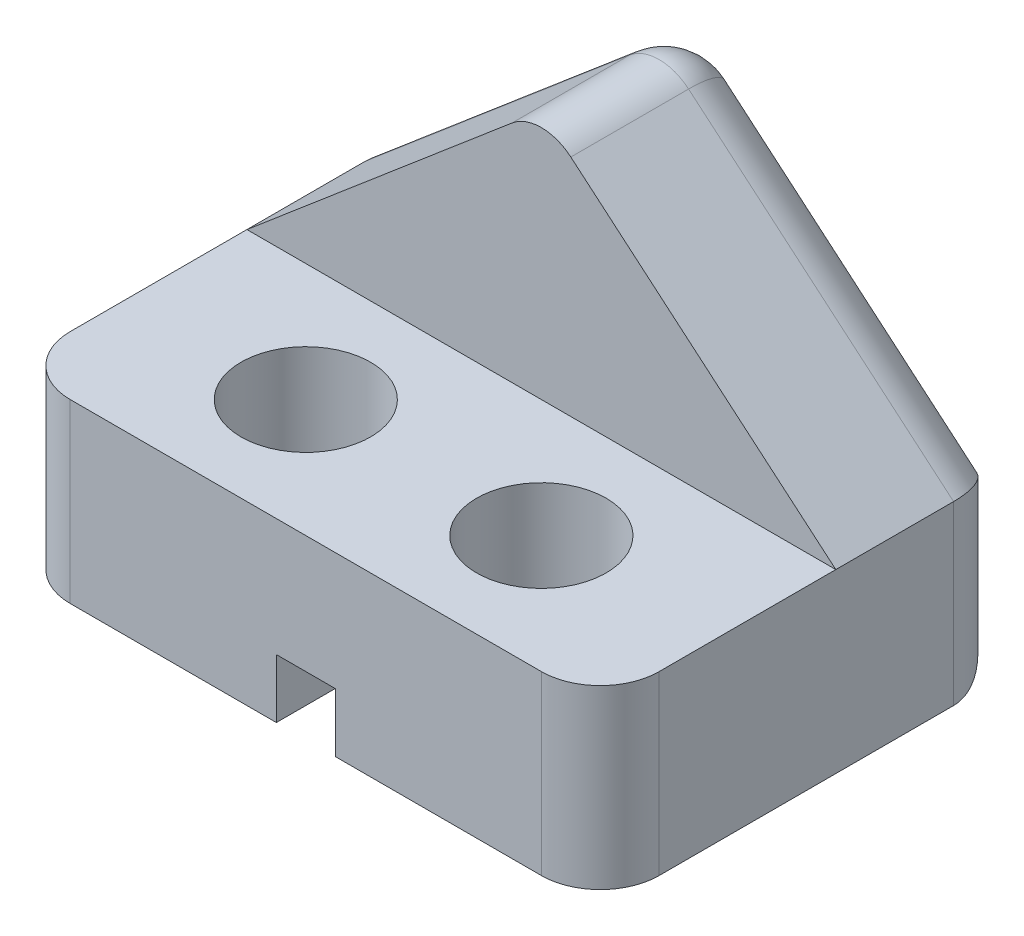
ISO-10303-21;
HEADER;
FILE_DESCRIPTION(('STEP AP214'),'2;1');
FILE_NAME('part.step','',(''),(''),'','','');
FILE_SCHEMA(('AUTOMOTIVE_DESIGN { 1 0 10303 214 1 1 1 1 }'));
ENDSEC;
DATA;
#1=APPLICATION_CONTEXT('core data for automotive mechanical design processes');
#2=APPLICATION_PROTOCOL_DEFINITION('international standard','automotive_design',2000,#1);
#3=PRODUCT_CONTEXT('',#1,'mechanical');
#4=PRODUCT('Part','Part','',(#3));
#5=PRODUCT_RELATED_PRODUCT_CATEGORY('part','',(#4));
#6=PRODUCT_DEFINITION_FORMATION('','',#4);
#7=PRODUCT_DEFINITION_CONTEXT('part definition',#1,'design');
#8=PRODUCT_DEFINITION('design','',#6,#7);
#9=PRODUCT_DEFINITION_SHAPE('','',#8);
#10=(LENGTH_UNIT() NAMED_UNIT(*) SI_UNIT(.MILLI.,.METRE.));
#11=(NAMED_UNIT(*) PLANE_ANGLE_UNIT() SI_UNIT($,.RADIAN.));
#12=(NAMED_UNIT(*) SI_UNIT($,.STERADIAN.) SOLID_ANGLE_UNIT());
#13=UNCERTAINTY_MEASURE_WITH_UNIT(LENGTH_MEASURE(1.E-05),#10,'distance_accuracy_value','');
#14=(GEOMETRIC_REPRESENTATION_CONTEXT(3) GLOBAL_UNCERTAINTY_ASSIGNED_CONTEXT((#13)) GLOBAL_UNIT_ASSIGNED_CONTEXT((#10,
#11,#12)) REPRESENTATION_CONTEXT('',''));
#15=CARTESIAN_POINT('',(0.,0.,0.));
#16=DIRECTION('',(0.,0.,1.));
#17=DIRECTION('',(1.,0.,0.));
#18=AXIS2_PLACEMENT_3D('',#15,#16,#17);
#19=CARTESIAN_POINT('',(0.,0.,0.));
#20=DIRECTION('',(0.,1.,0.));
#21=DIRECTION('',(0.,0.,1.));
#22=AXIS2_PLACEMENT_3D('',#19,#20,#21);
#23=PLANE('',#22);
#24=CARTESIAN_POINT('',(-2.,0.,0.));
#25=DIRECTION('',(0.,1.,0.));
#26=DIRECTION('',(0.,0.,1.));
#27=AXIS2_PLACEMENT_3D('',#24,#25,#26);
#28=CIRCLE('',#27,1.1);
#29=CARTESIAN_POINT('',(-2.,0.,1.1));
#30=VERTEX_POINT('',#29);
#31=EDGE_CURVE('E217',#30,#30,#28,.T.);
#32=ORIENTED_EDGE('',*,*,#31,.T.);
#33=EDGE_LOOP('',(#32));
#34=FACE_BOUND('',#33,.T.);
#35=DIRECTION('',(0.,0.,1.));
#36=VECTOR('',#35,1.);
#37=CARTESIAN_POINT('',(-5.,0.,-2.));
#38=LINE('',#37,#36);
#39=CARTESIAN_POINT('',(-5.,0.,-4.));
#40=VERTEX_POINT('',#39);
#41=CARTESIAN_POINT('',(-5.,0.,1.));
#42=VERTEX_POINT('',#41);
#43=EDGE_CURVE('E238',#40,#42,#38,.T.);
#44=ORIENTED_EDGE('',*,*,#43,.F.);
#45=DIRECTION('',(-1.,0.,0.));
#46=VECTOR('',#45,1.);
#47=CARTESIAN_POINT('',(0.,0.,-4.));
#48=LINE('',#47,#46);
#49=CARTESIAN_POINT('',(-0.5,0.,-4.));
#50=VERTEX_POINT('',#49);
#51=EDGE_CURVE('E285',#40,#50,#48,.F.);
#52=ORIENTED_EDGE('',*,*,#51,.T.);
#53=DIRECTION('',(0.,0.,-1.));
#54=VECTOR('',#53,1.);
#55=CARTESIAN_POINT('',(-0.5,0.,2.));
#56=LINE('',#55,#54);
#57=CARTESIAN_POINT('',(-0.5,0.,2.));
#58=VERTEX_POINT('',#57);
#59=EDGE_CURVE('E189',#58,#50,#56,.T.);
#60=ORIENTED_EDGE('',*,*,#59,.F.);
#61=DIRECTION('',(1.,0.,0.));
#62=VECTOR('',#61,1.);
#63=CARTESIAN_POINT('',(-5.,0.,2.));
#64=LINE('',#63,#62);
#65=CARTESIAN_POINT('',(-4.,0.,2.));
#66=VERTEX_POINT('',#65);
#67=EDGE_CURVE('E183',#66,#58,#64,.T.);
#68=ORIENTED_EDGE('',*,*,#67,.F.);
#69=CARTESIAN_POINT('',(-4.,0.,1.));
#70=DIRECTION('',(0.,1.,0.));
#71=DIRECTION('',(0.,0.,1.));
#72=AXIS2_PLACEMENT_3D('',#69,#70,#71);
#73=CIRCLE('',#72,1.);
#74=EDGE_CURVE('E283',#66,#42,#73,.F.);
#75=ORIENTED_EDGE('',*,*,#74,.T.);
#76=EDGE_LOOP('',(#44,#52,#60,#68,#75));
#77=FACE_BOUND('',#76,.T.);
#78=ADVANCED_FACE('F35',(#34,#77),#23,.F.);
#79=CARTESIAN_POINT('',(0.,3.,0.));
#80=DIRECTION('',(0.,1.,0.));
#81=DIRECTION('',(0.,0.,1.));
#82=AXIS2_PLACEMENT_3D('',#79,#80,#81);
#83=PLANE('',#82);
#84=CARTESIAN_POINT('',(-2.,3.,0.));
#85=DIRECTION('',(0.,1.,0.));
#86=DIRECTION('',(0.,0.,1.));
#87=AXIS2_PLACEMENT_3D('',#84,#85,#86);
#88=CIRCLE('',#87,1.1);
#89=CARTESIAN_POINT('',(-2.,3.,1.1));
#90=VERTEX_POINT('',#89);
#91=EDGE_CURVE('E220',#90,#90,#88,.T.);
#92=ORIENTED_EDGE('',*,*,#91,.F.);
#93=EDGE_LOOP('',(#92));
#94=FACE_BOUND('',#93,.T.);
#95=DIRECTION('',(1.,0.,0.));
#96=VECTOR('',#95,1.);
#97=CARTESIAN_POINT('',(-5.,3.,2.));
#98=LINE('',#97,#96);
#99=CARTESIAN_POINT('',(-4.,3.,2.));
#100=VERTEX_POINT('',#99);
#101=CARTESIAN_POINT('',(4.,3.,2.));
#102=VERTEX_POINT('',#101);
#103=EDGE_CURVE('E233',#100,#102,#98,.T.);
#104=ORIENTED_EDGE('',*,*,#103,.T.);
#105=CARTESIAN_POINT('',(4.,3.,1.));
#106=DIRECTION('',(0.,1.,0.));
#107=DIRECTION('',(0.,0.,1.));
#108=AXIS2_PLACEMENT_3D('',#105,#106,#107);
#109=CIRCLE('',#108,1.);
#110=CARTESIAN_POINT('',(5.,3.,1.));
#111=VERTEX_POINT('',#110);
#112=EDGE_CURVE('E11',#102,#111,#109,.T.);
#113=ORIENTED_EDGE('',*,*,#112,.T.);
#114=DIRECTION('',(0.,0.,-1.));
#115=VECTOR('',#114,1.);
#116=CARTESIAN_POINT('',(5.,3.,-2.));
#117=LINE('',#116,#115);
#118=CARTESIAN_POINT('',(5.,3.,-2.));
#119=VERTEX_POINT('',#118);
#120=EDGE_CURVE('E226',#111,#119,#117,.T.);
#121=ORIENTED_EDGE('',*,*,#120,.T.);
#122=DIRECTION('',(-1.,0.,0.));
#123=VECTOR('',#122,1.);
#124=CARTESIAN_POINT('',(-5.,3.,-2.));
#125=LINE('',#124,#123);
#126=CARTESIAN_POINT('',(-5.,3.,-2.));
#127=VERTEX_POINT('',#126);
#128=EDGE_CURVE('E228',#119,#127,#125,.T.);
#129=ORIENTED_EDGE('',*,*,#128,.T.);
#130=DIRECTION('',(0.,0.,1.));
#131=VECTOR('',#130,1.);
#132=CARTESIAN_POINT('',(-5.,3.,-2.));
#133=LINE('',#132,#131);
#134=CARTESIAN_POINT('',(-5.,3.,1.));
#135=VERTEX_POINT('',#134);
#136=EDGE_CURVE('E231',#127,#135,#133,.T.);
#137=ORIENTED_EDGE('',*,*,#136,.T.);
#138=CARTESIAN_POINT('',(-4.,3.,1.));
#139=DIRECTION('',(0.,1.,0.));
#140=DIRECTION('',(0.,0.,1.));
#141=AXIS2_PLACEMENT_3D('',#138,#139,#140);
#142=CIRCLE('',#141,1.);
#143=EDGE_CURVE('E44',#135,#100,#142,.T.);
#144=ORIENTED_EDGE('',*,*,#143,.T.);
#145=EDGE_LOOP('',(#104,#113,#121,#129,#137,#144));
#146=FACE_BOUND('',#145,.T.);
#147=CARTESIAN_POINT('',(2.,3.,0.));
#148=DIRECTION('',(0.,1.,0.));
#149=DIRECTION('',(0.,0.,-1.));
#150=AXIS2_PLACEMENT_3D('',#147,#148,#149);
#151=CIRCLE('',#150,1.1);
#152=CARTESIAN_POINT('',(2.,3.,-1.1));
#153=VERTEX_POINT('',#152);
#154=EDGE_CURVE('E214',#153,#153,#151,.T.);
#155=ORIENTED_EDGE('',*,*,#154,.F.);
#156=EDGE_LOOP('',(#155));
#157=FACE_BOUND('',#156,.T.);
#158=ADVANCED_FACE('F372',(#94,#146,#157),#83,.T.);
#159=DIRECTION('',(0.,0.,-1.));
#160=VECTOR('',#159,1.);
#161=CARTESIAN_POINT('',(0.5,0.,2.));
#162=LINE('',#161,#160);
#163=CARTESIAN_POINT('',(0.5,0.,2.));
#164=VERTEX_POINT('',#163);
#165=CARTESIAN_POINT('',(0.5,0.,-4.));
#166=VERTEX_POINT('',#165);
#167=EDGE_CURVE('E192',#164,#166,#162,.T.);
#168=ORIENTED_EDGE('',*,*,#167,.T.);
#169=DIRECTION('',(-1.,0.,0.));
#170=VECTOR('',#169,1.);
#171=CARTESIAN_POINT('',(0.,0.,-4.));
#172=LINE('',#171,#170);
#173=CARTESIAN_POINT('',(5.,0.,-4.));
#174=VERTEX_POINT('',#173);
#175=EDGE_CURVE('E266',#166,#174,#172,.F.);
#176=ORIENTED_EDGE('',*,*,#175,.T.);
#177=DIRECTION('',(0.,0.,-1.));
#178=VECTOR('',#177,1.);
#179=CARTESIAN_POINT('',(5.,0.,-2.));
#180=LINE('',#179,#178);
#181=CARTESIAN_POINT('',(5.,0.,1.));
#182=VERTEX_POINT('',#181);
#183=EDGE_CURVE('E223',#182,#174,#180,.T.);
#184=ORIENTED_EDGE('',*,*,#183,.F.);
#185=CARTESIAN_POINT('',(4.,0.,1.));
#186=DIRECTION('',(0.,1.,0.));
#187=DIRECTION('',(0.,0.,1.));
#188=AXIS2_PLACEMENT_3D('',#185,#186,#187);
#189=CIRCLE('',#188,1.);
#190=CARTESIAN_POINT('',(4.,0.,2.));
#191=VERTEX_POINT('',#190);
#192=EDGE_CURVE('E264',#182,#191,#189,.F.);
#193=ORIENTED_EDGE('',*,*,#192,.T.);
#194=EDGE_CURVE('E241',#164,#191,#64,.T.);
#195=ORIENTED_EDGE('',*,*,#194,.F.);
#196=EDGE_LOOP('',(#168,#176,#184,#193,#195));
#197=FACE_BOUND('',#196,.T.);
#198=CARTESIAN_POINT('',(2.,0.,0.));
#199=DIRECTION('',(0.,1.,0.));
#200=DIRECTION('',(0.,0.,-1.));
#201=AXIS2_PLACEMENT_3D('',#198,#199,#200);
#202=CIRCLE('',#201,1.1);
#203=CARTESIAN_POINT('',(2.,0.,-1.1));
#204=VERTEX_POINT('',#203);
#205=EDGE_CURVE('E213',#204,#204,#202,.T.);
#206=ORIENTED_EDGE('',*,*,#205,.T.);
#207=EDGE_LOOP('',(#206));
#208=FACE_BOUND('',#207,.T.);
#209=ADVANCED_FACE('F362',(#197,#208),#23,.F.);
#210=CARTESIAN_POINT('',(5.,3.,-2.));
#211=DIRECTION('',(-1.,0.,0.));
#212=DIRECTION('',(0.,0.,1.));
#213=AXIS2_PLACEMENT_3D('',#210,#211,#212);
#214=PLANE('',#213);
#215=ORIENTED_EDGE('',*,*,#183,.T.);
#216=DIRECTION('',(0.,-1.,0.));
#217=VECTOR('',#216,1.);
#218=CARTESIAN_POINT('',(5.,3.,-4.));
#219=LINE('',#218,#217);
#220=CARTESIAN_POINT('',(5.,3.,-4.));
#221=VERTEX_POINT('',#220);
#222=EDGE_CURVE('E271',#174,#221,#219,.F.);
#223=ORIENTED_EDGE('',*,*,#222,.T.);
#224=DIRECTION('',(0.,0.,1.));
#225=VECTOR('',#224,1.);
#226=CARTESIAN_POINT('',(5.,3.,-5.));
#227=LINE('',#226,#225);
#228=EDGE_CURVE('E206',#221,#119,#227,.T.);
#229=ORIENTED_EDGE('',*,*,#228,.T.);
#230=ORIENTED_EDGE('',*,*,#120,.F.);
#231=DIRECTION('',(0.,-1.,0.));
#232=VECTOR('',#231,1.);
#233=CARTESIAN_POINT('',(5.,3.,1.));
#234=LINE('',#233,#232);
#235=EDGE_CURVE('E268',#111,#182,#234,.T.);
#236=ORIENTED_EDGE('',*,*,#235,.T.);
#237=EDGE_LOOP('',(#215,#223,#229,#230,#236));
#238=FACE_BOUND('',#237,.T.);
#239=ADVANCED_FACE('F358',(#238),#214,.F.);
#240=CARTESIAN_POINT('',(-5.,3.,-2.));
#241=DIRECTION('',(1.,0.,0.));
#242=DIRECTION('',(0.,0.,-1.));
#243=AXIS2_PLACEMENT_3D('',#240,#241,#242);
#244=PLANE('',#243);
#245=DIRECTION('',(0.,0.,1.));
#246=VECTOR('',#245,1.);
#247=CARTESIAN_POINT('',(-5.,3.,-5.));
#248=LINE('',#247,#246);
#249=CARTESIAN_POINT('',(-5.,3.,-4.));
#250=VERTEX_POINT('',#249);
#251=EDGE_CURVE('E204',#250,#127,#248,.T.);
#252=ORIENTED_EDGE('',*,*,#251,.F.);
#253=DIRECTION('',(0.,1.,0.));
#254=VECTOR('',#253,1.);
#255=CARTESIAN_POINT('',(-5.,3.,-4.));
#256=LINE('',#255,#254);
#257=EDGE_CURVE('E281',#250,#40,#256,.F.);
#258=ORIENTED_EDGE('',*,*,#257,.T.);
#259=ORIENTED_EDGE('',*,*,#43,.T.);
#260=DIRECTION('',(0.,-1.,0.));
#261=VECTOR('',#260,1.);
#262=CARTESIAN_POINT('',(-5.,3.,1.));
#263=LINE('',#262,#261);
#264=EDGE_CURVE('E279',#42,#135,#263,.F.);
#265=ORIENTED_EDGE('',*,*,#264,.T.);
#266=ORIENTED_EDGE('',*,*,#136,.F.);
#267=EDGE_LOOP('',(#252,#258,#259,#265,#266));
#268=FACE_BOUND('',#267,.T.);
#269=ADVANCED_FACE('F361',(#268),#244,.F.);
#270=CARTESIAN_POINT('',(-5.,3.,2.));
#271=DIRECTION('',(0.,0.,-1.));
#272=DIRECTION('',(-1.,0.,0.));
#273=AXIS2_PLACEMENT_3D('',#270,#271,#272);
#274=PLANE('',#273);
#275=ORIENTED_EDGE('',*,*,#194,.T.);
#276=DIRECTION('',(0.,-1.,0.));
#277=VECTOR('',#276,1.);
#278=CARTESIAN_POINT('',(4.,3.,2.));
#279=LINE('',#278,#277);
#280=EDGE_CURVE('E52',#191,#102,#279,.F.);
#281=ORIENTED_EDGE('',*,*,#280,.T.);
#282=ORIENTED_EDGE('',*,*,#103,.F.);
#283=DIRECTION('',(0.,-1.,0.));
#284=VECTOR('',#283,1.);
#285=CARTESIAN_POINT('',(-4.,3.,2.));
#286=LINE('',#285,#284);
#287=EDGE_CURVE('E290',#100,#66,#286,.T.);
#288=ORIENTED_EDGE('',*,*,#287,.T.);
#289=ORIENTED_EDGE('',*,*,#67,.T.);
#290=DIRECTION('',(0.,1.,0.));
#291=VECTOR('',#290,1.);
#292=CARTESIAN_POINT('',(-0.5,1.,2.));
#293=LINE('',#292,#291);
#294=CARTESIAN_POINT('',(-0.5,1.,2.));
#295=VERTEX_POINT('',#294);
#296=EDGE_CURVE('E164',#58,#295,#293,.T.);
#297=ORIENTED_EDGE('',*,*,#296,.T.);
#298=DIRECTION('',(1.,0.,0.));
#299=VECTOR('',#298,1.);
#300=CARTESIAN_POINT('',(0.5,1.,2.));
#301=LINE('',#300,#299);
#302=CARTESIAN_POINT('',(0.5,1.,2.));
#303=VERTEX_POINT('',#302);
#304=EDGE_CURVE('E174',#295,#303,#301,.T.);
#305=ORIENTED_EDGE('',*,*,#304,.T.);
#306=DIRECTION('',(0.,-1.,0.));
#307=VECTOR('',#306,1.);
#308=CARTESIAN_POINT('',(0.5,1.,2.));
#309=LINE('',#308,#307);
#310=EDGE_CURVE('E171',#303,#164,#309,.T.);
#311=ORIENTED_EDGE('',*,*,#310,.T.);
#312=EDGE_LOOP('',(#275,#281,#282,#288,#289,#297,#305,#311));
#313=FACE_BOUND('',#312,.T.);
#314=ADVANCED_FACE('F180',(#313),#274,.F.);
#315=CARTESIAN_POINT('',(-2.,3.,0.));
#316=DIRECTION('',(0.,-1.,0.));
#317=DIRECTION('',(0.,0.,-1.));
#318=AXIS2_PLACEMENT_3D('',#315,#316,#317);
#319=CYLINDRICAL_SURFACE('',#318,1.1);
#320=ORIENTED_EDGE('',*,*,#91,.T.);
#321=EDGE_LOOP('',(#320));
#322=FACE_BOUND('',#321,.T.);
#323=ORIENTED_EDGE('',*,*,#31,.F.);
#324=EDGE_LOOP('',(#323));
#325=FACE_BOUND('',#324,.T.);
#326=ADVANCED_FACE('F369',(#322,#325),#319,.F.);
#327=CARTESIAN_POINT('',(2.,3.,0.));
#328=DIRECTION('',(0.,-1.,0.));
#329=DIRECTION('',(0.,0.,-1.));
#330=AXIS2_PLACEMENT_3D('',#327,#328,#329);
#331=CYLINDRICAL_SURFACE('',#330,1.1);
#332=ORIENTED_EDGE('',*,*,#154,.T.);
#333=EDGE_LOOP('',(#332));
#334=FACE_BOUND('',#333,.T.);
#335=ORIENTED_EDGE('',*,*,#205,.F.);
#336=EDGE_LOOP('',(#335));
#337=FACE_BOUND('',#336,.T.);
#338=ADVANCED_FACE('F379',(#334,#337),#331,.F.);
#339=CARTESIAN_POINT('',(0.,6.22698011099707,-2.));
#340=DIRECTION('',(0.,0.,1.));
#341=DIRECTION('',(1.,0.,0.));
#342=AXIS2_PLACEMENT_3D('',#339,#340,#341);
#343=PLANE('',#342);
#344=ORIENTED_EDGE('',*,*,#128,.F.);
#345=DIRECTION('',(0.762647883452918,-0.646813888119902,0.));
#346=VECTOR('',#345,1.);
#347=CARTESIAN_POINT('',(5.,3.,-2.));
#348=LINE('',#347,#346);
#349=CARTESIAN_POINT('',(0.5,6.81652209321216,-2.));
#350=VERTEX_POINT('',#349);
#351=EDGE_CURVE('E201',#350,#119,#348,.T.);
#352=ORIENTED_EDGE('',*,*,#351,.F.);
#353=CARTESIAN_POINT('',(0.,6.22698011099707,-2.));
#354=DIRECTION('',(0.,0.,-1.));
#355=DIRECTION('',(1.,0.,0.));
#356=AXIS2_PLACEMENT_3D('',#353,#354,#355);
#357=CIRCLE('',#356,0.773019889002931);
#358=CARTESIAN_POINT('',(-0.5,6.81652209321216,-2.));
#359=VERTEX_POINT('',#358);
#360=EDGE_CURVE('E198',#359,#350,#357,.T.);
#361=ORIENTED_EDGE('',*,*,#360,.F.);
#362=DIRECTION('',(0.762647883452918,0.646813888119902,0.));
#363=VECTOR('',#362,1.);
#364=CARTESIAN_POINT('',(-5.,3.,-2.));
#365=LINE('',#364,#363);
#366=EDGE_CURVE('E191',#127,#359,#365,.T.);
#367=ORIENTED_EDGE('',*,*,#366,.F.);
#368=EDGE_LOOP('',(#344,#352,#361,#367));
#369=FACE_BOUND('',#368,.T.);
#370=ADVANCED_FACE('F383',(#369),#343,.T.);
#371=CARTESIAN_POINT('',(-5.,3.,-5.));
#372=DIRECTION('',(0.646813888119902,-0.762647883452918,0.));
#373=DIRECTION('',(0.762647883452918,0.646813888119902,0.));
#374=AXIS2_PLACEMENT_3D('',#371,#372,#373);
#375=PLANE('',#374);
#376=DIRECTION('',(0.,0.,1.));
#377=VECTOR('',#376,1.);
#378=CARTESIAN_POINT('',(-0.5,6.81652209321216,-5.));
#379=LINE('',#378,#377);
#380=CARTESIAN_POINT('',(-0.5,6.81652209321216,-4.));
#381=VERTEX_POINT('',#380);
#382=EDGE_CURVE('E211',#381,#359,#379,.T.);
#383=ORIENTED_EDGE('',*,*,#382,.F.);
#384=DIRECTION('',(0.762647883452918,0.646813888119902,0.));
#385=VECTOR('',#384,1.);
#386=CARTESIAN_POINT('',(-5.,3.,-4.));
#387=LINE('',#386,#385);
#388=EDGE_CURVE('E277',#381,#250,#387,.F.);
#389=ORIENTED_EDGE('',*,*,#388,.T.);
#390=ORIENTED_EDGE('',*,*,#251,.T.);
#391=ORIENTED_EDGE('',*,*,#366,.T.);
#392=EDGE_LOOP('',(#383,#389,#390,#391));
#393=FACE_BOUND('',#392,.T.);
#394=ADVANCED_FACE('F385',(#393),#375,.F.);
#395=CARTESIAN_POINT('',(0.,6.22698011099707,-5.));
#396=DIRECTION('',(0.,0.,1.));
#397=DIRECTION('',(1.,0.,0.));
#398=AXIS2_PLACEMENT_3D('',#395,#396,#397);
#399=CYLINDRICAL_SURFACE('',#398,0.773019889002931);
#400=DIRECTION('',(0.,0.,1.));
#401=VECTOR('',#400,1.);
#402=CARTESIAN_POINT('',(0.5,6.81652209321216,-5.));
#403=LINE('',#402,#401);
#404=CARTESIAN_POINT('',(0.5,6.81652209321216,-4.));
#405=VERTEX_POINT('',#404);
#406=EDGE_CURVE('E209',#405,#350,#403,.T.);
#407=ORIENTED_EDGE('',*,*,#406,.F.);
#408=CARTESIAN_POINT('',(0.,6.22698011099707,-4.));
#409=DIRECTION('',(0.,0.,1.));
#410=DIRECTION('',(1.,0.,0.));
#411=AXIS2_PLACEMENT_3D('',#408,#409,#410);
#412=CIRCLE('',#411,0.773019889002931);
#413=EDGE_CURVE('E275',#405,#381,#412,.T.);
#414=ORIENTED_EDGE('',*,*,#413,.T.);
#415=ORIENTED_EDGE('',*,*,#382,.T.);
#416=ORIENTED_EDGE('',*,*,#360,.T.);
#417=EDGE_LOOP('',(#407,#414,#415,#416));
#418=FACE_BOUND('',#417,.T.);
#419=ADVANCED_FACE('F388',(#418),#399,.T.);
#420=CARTESIAN_POINT('',(5.,3.,-5.));
#421=DIRECTION('',(-0.646813888119902,-0.762647883452918,0.));
#422=DIRECTION('',(0.762647883452918,-0.646813888119902,0.));
#423=AXIS2_PLACEMENT_3D('',#420,#421,#422);
#424=PLANE('',#423);
#425=ORIENTED_EDGE('',*,*,#228,.F.);
#426=DIRECTION('',(0.762647883452918,-0.646813888119902,0.));
#427=VECTOR('',#426,1.);
#428=CARTESIAN_POINT('',(5.,3.,-4.));
#429=LINE('',#428,#427);
#430=EDGE_CURVE('E273',#221,#405,#429,.F.);
#431=ORIENTED_EDGE('',*,*,#430,.T.);
#432=ORIENTED_EDGE('',*,*,#406,.T.);
#433=ORIENTED_EDGE('',*,*,#351,.T.);
#434=EDGE_LOOP('',(#425,#431,#432,#433));
#435=FACE_BOUND('',#434,.T.);
#436=ADVANCED_FACE('F392',(#435),#424,.F.);
#437=CARTESIAN_POINT('',(0.,6.22698011099707,-5.));
#438=DIRECTION('',(0.,0.,1.));
#439=DIRECTION('',(1.,0.,0.));
#440=AXIS2_PLACEMENT_3D('',#437,#438,#439);
#441=PLANE('',#440);
#442=DIRECTION('',(-1.,0.,0.));
#443=VECTOR('',#442,1.);
#444=CARTESIAN_POINT('',(0.,1.,-5.));
#445=LINE('',#444,#443);
#446=CARTESIAN_POINT('',(4.,1.,-5.));
#447=VERTEX_POINT('',#446);
#448=CARTESIAN_POINT('',(1.5,1.,-5.));
#449=VERTEX_POINT('',#448);
#450=EDGE_CURVE('E259',#447,#449,#445,.T.);
#451=ORIENTED_EDGE('',*,*,#450,.T.);
#452=DIRECTION('',(0.,-1.,0.));
#453=VECTOR('',#452,1.);
#454=CARTESIAN_POINT('',(1.5,6.22698011099707,-5.));
#455=LINE('',#454,#453);
#456=CARTESIAN_POINT('',(1.5,2.,-5.));
#457=VERTEX_POINT('',#456);
#458=EDGE_CURVE('E261',#449,#457,#455,.F.);
#459=ORIENTED_EDGE('',*,*,#458,.T.);
#460=DIRECTION('',(1.,0.,0.));
#461=VECTOR('',#460,1.);
#462=CARTESIAN_POINT('',(0.,2.,-5.));
#463=LINE('',#462,#461);
#464=CARTESIAN_POINT('',(-1.5,2.,-5.));
#465=VERTEX_POINT('',#464);
#466=EDGE_CURVE('E245',#457,#465,#463,.F.);
#467=ORIENTED_EDGE('',*,*,#466,.T.);
#468=DIRECTION('',(0.,1.,0.));
#469=VECTOR('',#468,1.);
#470=CARTESIAN_POINT('',(-1.5,6.22698011099707,-5.));
#471=LINE('',#470,#469);
#472=CARTESIAN_POINT('',(-1.5,1.,-5.));
#473=VERTEX_POINT('',#472);
#474=EDGE_CURVE('E247',#465,#473,#471,.F.);
#475=ORIENTED_EDGE('',*,*,#474,.T.);
#476=DIRECTION('',(-1.,0.,0.));
#477=VECTOR('',#476,1.);
#478=CARTESIAN_POINT('',(0.,1.,-5.));
#479=LINE('',#478,#477);
#480=CARTESIAN_POINT('',(-4.,1.,-5.));
#481=VERTEX_POINT('',#480);
#482=EDGE_CURVE('E249',#473,#481,#479,.T.);
#483=ORIENTED_EDGE('',*,*,#482,.T.);
#484=DIRECTION('',(0.,1.,0.));
#485=VECTOR('',#484,1.);
#486=CARTESIAN_POINT('',(-4.,6.22698011099707,-5.));
#487=LINE('',#486,#485);
#488=CARTESIAN_POINT('',(-4.,2.53689491632621,-5.));
#489=VERTEX_POINT('',#488);
#490=EDGE_CURVE('E251',#481,#489,#487,.T.);
#491=ORIENTED_EDGE('',*,*,#490,.T.);
#492=DIRECTION('',(0.762647883452918,0.646813888119902,0.));
#493=VECTOR('',#492,1.);
#494=CARTESIAN_POINT('',(0.146813888119902,6.05387420975925,-5.));
#495=LINE('',#494,#493);
#496=CARTESIAN_POINT('',(0.,5.92935899918147,-5.));
#497=VERTEX_POINT('',#496);
#498=EDGE_CURVE('E253',#489,#497,#495,.T.);
#499=ORIENTED_EDGE('',*,*,#498,.T.);
#500=DIRECTION('',(0.762647883452918,-0.646813888119902,0.));
#501=VECTOR('',#500,1.);
#502=CARTESIAN_POINT('',(-0.146813888119901,6.05387420975925,-5.));
#503=LINE('',#502,#501);
#504=CARTESIAN_POINT('',(4.,2.53689491632621,-5.));
#505=VERTEX_POINT('',#504);
#506=EDGE_CURVE('E255',#497,#505,#503,.T.);
#507=ORIENTED_EDGE('',*,*,#506,.T.);
#508=DIRECTION('',(0.,-1.,0.));
#509=VECTOR('',#508,1.);
#510=CARTESIAN_POINT('',(4.,6.22698011099707,-5.));
#511=LINE('',#510,#509);
#512=EDGE_CURVE('E257',#505,#447,#511,.T.);
#513=ORIENTED_EDGE('',*,*,#512,.T.);
#514=EDGE_LOOP('',(#451,#459,#467,#475,#483,#491,#499,#507,#513));
#515=FACE_BOUND('',#514,.T.);
#516=ADVANCED_FACE('F396',(#515),#441,.F.);
#517=CARTESIAN_POINT('',(-0.5,1.,2.));
#518=DIRECTION('',(-1.,0.,0.));
#519=DIRECTION('',(0.,-1.,0.));
#520=AXIS2_PLACEMENT_3D('',#517,#518,#519);
#521=PLANE('',#520);
#522=ORIENTED_EDGE('',*,*,#59,.T.);
#523=DIRECTION('',(0.,1.,0.));
#524=VECTOR('',#523,1.);
#525=CARTESIAN_POINT('',(-0.5,1.,-4.));
#526=LINE('',#525,#524);
#527=CARTESIAN_POINT('',(-0.5,1.,-4.));
#528=VERTEX_POINT('',#527);
#529=EDGE_CURVE('E167',#50,#528,#526,.T.);
#530=ORIENTED_EDGE('',*,*,#529,.T.);
#531=DIRECTION('',(0.,0.,-1.));
#532=VECTOR('',#531,1.);
#533=CARTESIAN_POINT('',(-0.5,1.,2.));
#534=LINE('',#533,#532);
#535=EDGE_CURVE('E159',#295,#528,#534,.T.);
#536=ORIENTED_EDGE('',*,*,#535,.F.);
#537=ORIENTED_EDGE('',*,*,#296,.F.);
#538=EDGE_LOOP('',(#522,#530,#536,#537));
#539=FACE_BOUND('',#538,.T.);
#540=ADVANCED_FACE('F162',(#539),#521,.F.);
#541=CARTESIAN_POINT('',(0.5,1.,2.));
#542=DIRECTION('',(1.,0.,0.));
#543=DIRECTION('',(0.,1.,0.));
#544=AXIS2_PLACEMENT_3D('',#541,#542,#543);
#545=PLANE('',#544);
#546=DIRECTION('',(0.,0.,-1.));
#547=VECTOR('',#546,1.);
#548=CARTESIAN_POINT('',(0.5,1.,2.));
#549=LINE('',#548,#547);
#550=CARTESIAN_POINT('',(0.5,1.,-4.));
#551=VERTEX_POINT('',#550);
#552=EDGE_CURVE('E170',#303,#551,#549,.T.);
#553=ORIENTED_EDGE('',*,*,#552,.T.);
#554=DIRECTION('',(0.,-1.,0.));
#555=VECTOR('',#554,1.);
#556=CARTESIAN_POINT('',(0.5,1.,-4.));
#557=LINE('',#556,#555);
#558=EDGE_CURVE('E235',#551,#166,#557,.T.);
#559=ORIENTED_EDGE('',*,*,#558,.T.);
#560=ORIENTED_EDGE('',*,*,#167,.F.);
#561=ORIENTED_EDGE('',*,*,#310,.F.);
#562=EDGE_LOOP('',(#553,#559,#560,#561));
#563=FACE_BOUND('',#562,.T.);
#564=ADVANCED_FACE('F406',(#563),#545,.F.);
#565=CARTESIAN_POINT('',(0.5,1.,2.));
#566=DIRECTION('',(0.,1.,0.));
#567=DIRECTION('',(0.,0.,1.));
#568=AXIS2_PLACEMENT_3D('',#565,#566,#567);
#569=PLANE('',#568);
#570=ORIENTED_EDGE('',*,*,#535,.T.);
#571=DIRECTION('',(1.,0.,0.));
#572=VECTOR('',#571,1.);
#573=CARTESIAN_POINT('',(0.5,1.,-4.));
#574=LINE('',#573,#572);
#575=EDGE_CURVE('E288',#528,#551,#574,.T.);
#576=ORIENTED_EDGE('',*,*,#575,.T.);
#577=ORIENTED_EDGE('',*,*,#552,.F.);
#578=ORIENTED_EDGE('',*,*,#304,.F.);
#579=EDGE_LOOP('',(#570,#576,#577,#578));
#580=FACE_BOUND('',#579,.T.);
#581=ADVANCED_FACE('F175',(#580),#569,.F.);
#582=CARTESIAN_POINT('',(0.146813888119901,6.05387420975925,-4.));
#583=DIRECTION('',(0.762647883452918,0.646813888119902,0.));
#584=DIRECTION('',(-0.646813888119902,0.762647883452918,0.));
#585=AXIS2_PLACEMENT_3D('',#582,#583,#584);
#586=CYLINDRICAL_SURFACE('',#585,1.);
#587=CARTESIAN_POINT('',(0.,5.92935899918147,-4.));
#588=DIRECTION('',(-0.87116790978128,-0.490985206464834,0.));
#589=DIRECTION('',(0.490985206464834,-0.87116790978128,0.));
#590=AXIS2_PLACEMENT_3D('',#587,#588,#589);
#591=ELLIPSE('',#590,1.01836062149423,1.);
#592=EDGE_CURVE('E186',#497,#381,#591,.F.);
#593=ORIENTED_EDGE('',*,*,#592,.F.);
#594=ORIENTED_EDGE('',*,*,#498,.F.);
#595=CARTESIAN_POINT('',(-4.,2.53689491632621,-4.));
#596=DIRECTION('',(0.420229765652136,0.907417734045324,0.));
#597=DIRECTION('',(-0.907417734045324,0.420229765652136,0.));
#598=AXIS2_PLACEMENT_3D('',#595,#596,#597);
#599=ELLIPSE('',#598,1.10202827482987,1.);
#600=EDGE_CURVE('E39',#250,#489,#599,.F.);
#601=ORIENTED_EDGE('',*,*,#600,.F.);
#602=ORIENTED_EDGE('',*,*,#388,.F.);
#603=EDGE_LOOP('',(#593,#594,#601,#602));
#604=FACE_BOUND('',#603,.T.);
#605=ADVANCED_FACE('F329',(#604),#586,.T.);
#606=CARTESIAN_POINT('',(-4.,6.22698011099707,-4.));
#607=DIRECTION('',(0.,1.,0.));
#608=DIRECTION('',(0.,0.,1.));
#609=AXIS2_PLACEMENT_3D('',#606,#607,#608);
#610=CYLINDRICAL_SURFACE('',#609,1.);
#611=ORIENTED_EDGE('',*,*,#600,.T.);
#612=ORIENTED_EDGE('',*,*,#490,.F.);
#613=CARTESIAN_POINT('',(-4.,1.,-4.));
#614=DIRECTION('',(-0.707106781186547,0.707106781186547,0.));
#615=DIRECTION('',(-0.707106781186547,-0.707106781186547,0.));
#616=AXIS2_PLACEMENT_3D('',#613,#614,#615);
#617=ELLIPSE('',#616,1.41421356237309,1.);
#618=EDGE_CURVE('E313',#40,#481,#617,.F.);
#619=ORIENTED_EDGE('',*,*,#618,.F.);
#620=ORIENTED_EDGE('',*,*,#257,.F.);
#621=EDGE_LOOP('',(#611,#612,#619,#620));
#622=FACE_BOUND('',#621,.T.);
#623=ADVANCED_FACE('F327',(#622),#610,.T.);
#624=CARTESIAN_POINT('',(0.,5.92935899918147,-5.));
#625=CARTESIAN_POINT('',(0.,5.92935899918147,-5.));
#626=CARTESIAN_POINT('',(0.,5.92935899918147,-5.));
#627=CARTESIAN_POINT('',(-0.0217876659188029,5.96801742539794,-4.99998856150455));
#628=CARTESIAN_POINT('',(0.,5.96802069753583,-4.99996348144833));
#629=CARTESIAN_POINT('',(0.0217876659188032,5.96801742539794,-4.99998856150455));
#630=CARTESIAN_POINT('',(-0.0435805187189027,6.00668505483372,-4.99715072962758));
#631=CARTESIAN_POINT('',(0.,6.00677803039969,-4.99899062149441));
#632=CARTESIAN_POINT('',(0.0435805187189031,6.00668505483372,-4.99715072962758));
#633=CARTESIAN_POINT('',(-0.0867916252031601,6.08335565268385,-4.98577953162601));
#634=CARTESIAN_POINT('',(0.,6.08454861698618,-4.99490792579697));
#635=CARTESIAN_POINT('',(0.0867916252031604,6.08335565268385,-4.98577953162601));
#636=CARTESIAN_POINT('',(-0.108211440269281,6.1213613914991,-4.97728677383206));
#637=CARTESIAN_POINT('',(0.,6.12374438211607,-4.99179354014729));
#638=CARTESIAN_POINT('',(0.108211440269282,6.1213613914991,-4.97728677383206));
#639=CARTESIAN_POINT('',(-0.150311457227983,6.19606055410675,-4.95472359675479));
#640=CARTESIAN_POINT('',(0.,6.20281668090408,-4.98313708448574));
#641=CARTESIAN_POINT('',(0.150311457227984,6.19606055410675,-4.95472359675479));
#642=CARTESIAN_POINT('',(-0.170997811275426,6.23276489382864,-4.94073275770845));
#643=CARTESIAN_POINT('',(0.,6.24287103513949,-4.97758654479552));
#644=CARTESIAN_POINT('',(0.170997811275426,6.23276489382864,-4.94073275770845));
#645=CARTESIAN_POINT('',(-0.21127087096037,6.30422243830099,-4.90736989313806));
#646=CARTESIAN_POINT('',(0.,6.32402354270934,-4.96344608227702));
#647=CARTESIAN_POINT('',(0.21127087096037,6.30422243830099,-4.90736989313806));
#648=CARTESIAN_POINT('',(-0.230871397252103,6.3390001654002,-4.88811338856181));
#649=CARTESIAN_POINT('',(0.,6.36528869707676,-4.9548465511055));
#650=CARTESIAN_POINT('',(0.230871397252103,6.3390001654002,-4.88811338856181));
#651=CARTESIAN_POINT('',(-0.268629458774857,6.40599528277046,-4.84451378543715));
#652=CARTESIAN_POINT('',(0.,6.44908772790902,-4.93369454305549));
#653=CARTESIAN_POINT('',(0.268629458774857,6.40599528277046,-4.84451378543715));
#654=CARTESIAN_POINT('',(-0.286811301526878,6.43825580251258,-4.8203165288696));
#655=CARTESIAN_POINT('',(0.,6.491770865415,-4.92113610887615));
#656=CARTESIAN_POINT('',(0.286811301526878,6.43825580251258,-4.8203165288696));
#657=CARTESIAN_POINT('',(-0.32140973884192,6.49964471590666,-4.76721946802654));
#658=CARTESIAN_POINT('',(0.,6.5783463836214,-4.89079200012355));
#659=CARTESIAN_POINT('',(0.32140973884192,6.49964471590666,-4.76721946802654));
#660=CARTESIAN_POINT('',(-0.33786342747506,6.52883892653865,-4.73848719263389));
#661=CARTESIAN_POINT('',(0.,6.62236048651895,-4.87301307124615));
#662=CARTESIAN_POINT('',(0.33786342747506,6.52883892653865,-4.73848719263389));
#663=CARTESIAN_POINT('',(-0.368710673164672,6.58357200239529,-4.67679174730595));
#664=CARTESIAN_POINT('',(0.,6.71102515260293,-4.83061731230828));
#665=CARTESIAN_POINT('',(0.368710673164672,6.58357200239529,-4.67679174730595));
#666=CARTESIAN_POINT('',(-0.383155207504067,6.60920131794803,-4.64400533561461));
#667=CARTESIAN_POINT('',(0.,6.75575813018396,-4.80603516512872));
#668=CARTESIAN_POINT('',(0.383155207504067,6.60920131794803,-4.64400533561461));
#669=CARTESIAN_POINT('',(-0.409722708958127,6.65634073152933,-4.57475672214572));
#670=CARTESIAN_POINT('',(0.,6.84447160931641,-4.74825180762075));
#671=CARTESIAN_POINT('',(0.409722708958127,6.65634073152933,-4.57475672214572));
#672=CARTESIAN_POINT('',(-0.421909446562008,6.67796397920693,-4.53846429661991));
#673=CARTESIAN_POINT('',(0.,6.88848384004887,-4.71513668643138));
#674=CARTESIAN_POINT('',(0.421909446562009,6.67796397920693,-4.53846429661991));
#675=CARTESIAN_POINT('',(-0.443740212525624,6.71669887896161,-4.46283737167839));
#676=CARTESIAN_POINT('',(0.,6.97326940536661,-4.63876149975803));
#677=CARTESIAN_POINT('',(0.443740212525625,6.71669887896161,-4.46283737167839));
#678=CARTESIAN_POINT('',(-0.453456332207436,6.73393844455939,-4.42364738137221));
#679=CARTESIAN_POINT('',(0.,7.01401850012148,-4.595670172238));
#680=CARTESIAN_POINT('',(0.453456332207436,6.73393844455939,-4.42364738137221));
#681=CARTESIAN_POINT('',(-0.470172634701358,6.76359861784191,-4.34292938921745));
#682=CARTESIAN_POINT('',(0.,7.08866440097243,-4.49880451479588));
#683=CARTESIAN_POINT('',(0.470172634701359,6.76359861784191,-4.34292938921745));
#684=CARTESIAN_POINT('',(-0.477244559042928,6.77614651840115,-4.30150463065081));
#685=CARTESIAN_POINT('',(0.,7.1224902542387,-4.44531367890687));
#686=CARTESIAN_POINT('',(0.477244559042928,6.77614651840115,-4.30150463065081));
#687=CARTESIAN_POINT('',(-0.488554936425559,6.79621481718801,-4.21707647654015));
#688=CARTESIAN_POINT('',(0.,7.17909129587446,-4.32895100081584));
#689=CARTESIAN_POINT('',(0.488554936425559,6.79621481718801,-4.21707647654015));
#690=CARTESIAN_POINT('',(-0.492852535431395,6.80384015964985,-4.17412817442686));
#691=CARTESIAN_POINT('',(0.,7.20177864740899,-4.2664935676085));
#692=CARTESIAN_POINT('',(0.492852535431395,6.80384015964985,-4.17412817442686));
#693=CARTESIAN_POINT('',(-0.49855818292864,6.81396383942406,-4.08744294081929));
#694=CARTESIAN_POINT('',(0.,7.23255352663529,-4.13576934585148));
#695=CARTESIAN_POINT('',(0.49855818292864,6.81396383942406,-4.08744294081929));
#696=CARTESIAN_POINT('',(-0.5,6.81652209321216,-4.04372147040965));
#697=CARTESIAN_POINT('',(0.,7.24058010356907,-4.06802652663868));
#698=CARTESIAN_POINT('',(0.5,6.81652209321216,-4.04372147040965));
#699=CARTESIAN_POINT('',(-0.5,6.81652209321216,-3.95627852959036));
#700=CARTESIAN_POINT('',(0.,7.24058010356907,-3.93197347336132));
#701=CARTESIAN_POINT('',(0.5,6.81652209321216,-3.95627852959036));
#702=CARTESIAN_POINT('',(-0.49855818292864,6.81396383942406,-3.91255705918071));
#703=CARTESIAN_POINT('',(0.,7.23255352663529,-3.86423065414852));
#704=CARTESIAN_POINT('',(0.49855818292864,6.81396383942406,-3.91255705918071));
#705=CARTESIAN_POINT('',(-0.492852535431395,6.80384015964985,-3.82587182557315));
#706=CARTESIAN_POINT('',(0.,7.20177864740899,-3.7335064323915));
#707=CARTESIAN_POINT('',(0.492852535431395,6.80384015964985,-3.82587182557315));
#708=CARTESIAN_POINT('',(-0.488554936425559,6.79621481718801,-3.78292352345985));
#709=CARTESIAN_POINT('',(0.,7.17909129587446,-3.67104899918416));
#710=CARTESIAN_POINT('',(0.488554936425559,6.79621481718801,-3.78292352345985));
#711=CARTESIAN_POINT('',(-0.477244559042928,6.77614651840115,-3.69849536934919));
#712=CARTESIAN_POINT('',(0.,7.1224902542387,-3.55468632109313));
#713=CARTESIAN_POINT('',(0.477244559042928,6.77614651840115,-3.69849536934919));
#714=CARTESIAN_POINT('',(-0.470172634701359,6.76359861784191,-3.65707061078255));
#715=CARTESIAN_POINT('',(0.,7.08866440097243,-3.50119548520412));
#716=CARTESIAN_POINT('',(0.470172634701359,6.76359861784191,-3.65707061078255));
#717=CARTESIAN_POINT('',(-0.453456332207436,6.73393844455939,-3.57635261862779));
#718=CARTESIAN_POINT('',(0.,7.01401850012148,-3.404329827762));
#719=CARTESIAN_POINT('',(0.453456332207436,6.73393844455939,-3.57635261862779));
#720=CARTESIAN_POINT('',(-0.443740212525624,6.71669887896161,-3.53716262832161));
#721=CARTESIAN_POINT('',(0.,6.97326940536661,-3.36123850024198));
#722=CARTESIAN_POINT('',(0.443740212525624,6.71669887896161,-3.53716262832161));
#723=CARTESIAN_POINT('',(-0.421909446562009,6.67796397920693,-3.46153570338009));
#724=CARTESIAN_POINT('',(0.,6.88848384004887,-3.28486331356862));
#725=CARTESIAN_POINT('',(0.421909446562009,6.67796397920693,-3.46153570338009));
#726=CARTESIAN_POINT('',(-0.409722708958127,6.65634073152933,-3.42524327785428));
#727=CARTESIAN_POINT('',(0.,6.84447160931641,-3.25174819237925));
#728=CARTESIAN_POINT('',(0.409722708958128,6.65634073152933,-3.42524327785428));
#729=CARTESIAN_POINT('',(-0.383155207504067,6.60920131794803,-3.35599466438539));
#730=CARTESIAN_POINT('',(0.,6.75575813018396,-3.19396483487128));
#731=CARTESIAN_POINT('',(0.383155207504068,6.60920131794803,-3.35599466438539));
#732=CARTESIAN_POINT('',(-0.368710673164672,6.58357200239529,-3.32320825269406));
#733=CARTESIAN_POINT('',(0.,6.71102515260293,-3.16938268769173));
#734=CARTESIAN_POINT('',(0.368710673164672,6.58357200239529,-3.32320825269406));
#735=CARTESIAN_POINT('',(-0.33786342747506,6.52883892653865,-3.26151280736611));
#736=CARTESIAN_POINT('',(0.,6.62236048651896,-3.12698692875385));
#737=CARTESIAN_POINT('',(0.33786342747506,6.52883892653865,-3.26151280736611));
#738=CARTESIAN_POINT('',(-0.321409738841921,6.49964471590666,-3.23278053197346));
#739=CARTESIAN_POINT('',(0.,6.5783463836214,-3.10920799987646));
#740=CARTESIAN_POINT('',(0.321409738841921,6.49964471590666,-3.23278053197346));
#741=CARTESIAN_POINT('',(-0.286811301526879,6.43825580251258,-3.1796834711304));
#742=CARTESIAN_POINT('',(0.,6.491770865415,-3.07886389112385));
#743=CARTESIAN_POINT('',(0.286811301526879,6.43825580251258,-3.1796834711304));
#744=CARTESIAN_POINT('',(-0.268629458774858,6.40599528277046,-3.15548621456285));
#745=CARTESIAN_POINT('',(0.,6.44908772790902,-3.06630545694452));
#746=CARTESIAN_POINT('',(0.268629458774858,6.40599528277046,-3.15548621456285));
#747=CARTESIAN_POINT('',(-0.230871397252103,6.3390001654002,-3.11188661143819));
#748=CARTESIAN_POINT('',(0.,6.36528869707676,-3.04515344889451));
#749=CARTESIAN_POINT('',(0.230871397252103,6.3390001654002,-3.11188661143819));
#750=CARTESIAN_POINT('',(-0.211270870960371,6.30422243830099,-3.09263010686194));
#751=CARTESIAN_POINT('',(0.,6.32402354270934,-3.03655391772298));
#752=CARTESIAN_POINT('',(0.211270870960371,6.30422243830099,-3.09263010686194));
#753=CARTESIAN_POINT('',(-0.170997811275426,6.23276489382864,-3.05926724229155));
#754=CARTESIAN_POINT('',(0.,6.24287103513949,-3.02241345520448));
#755=CARTESIAN_POINT('',(0.170997811275426,6.23276489382864,-3.05926724229155));
#756=CARTESIAN_POINT('',(-0.150311457227983,6.19606055410675,-3.04527640324521));
#757=CARTESIAN_POINT('',(0.,6.20281668090408,-3.01686291551426));
#758=CARTESIAN_POINT('',(0.150311457227983,6.19606055410675,-3.04527640324521));
#759=CARTESIAN_POINT('',(-0.108211440269281,6.1213613914991,-3.02271322616794));
#760=CARTESIAN_POINT('',(0.,6.12374438211607,-3.00820645985271));
#761=CARTESIAN_POINT('',(0.108211440269281,6.1213613914991,-3.02271322616794));
#762=CARTESIAN_POINT('',(-0.0867916252031601,6.08335565268385,-3.01422046837399));
#763=CARTESIAN_POINT('',(0.,6.08454861698618,-3.00509207420303));
#764=CARTESIAN_POINT('',(0.0867916252031604,6.08335565268385,-3.01422046837399));
#765=CARTESIAN_POINT('',(-0.043580518718903,6.00668505483372,-3.00284927037242));
#766=CARTESIAN_POINT('',(0.,6.00677803039969,-3.0010093785056));
#767=CARTESIAN_POINT('',(0.0435805187189033,6.00668505483372,-3.00284927037242));
#768=CARTESIAN_POINT('',(-0.0217876659188031,5.96801742539794,-3.00001143849545));
#769=CARTESIAN_POINT('',(0.,5.96802069753583,-3.00003651855167));
#770=CARTESIAN_POINT('',(0.0217876659188034,5.96801742539794,-3.00001143849545));
#771=CARTESIAN_POINT('',(0.,5.92935899918147,-3.));
#772=CARTESIAN_POINT('',(0.,5.92935899918147,-3.));
#773=CARTESIAN_POINT('',(0.,5.92935899918147,-3.));
#774=(BOUNDED_SURFACE() B_SPLINE_SURFACE(3,2,((#624,#625,#626),(#627,#628,#629),(#630,#631,
#632),(#633,#634,#635),(#636,#637,#638),(#639,#640,#641),(#642,#643,#644),(#645,#646,#647),
(#648,#649,#650),(#651,#652,#653),(#654,#655,#656),(#657,#658,#659),(#660,#661,#662),(#663,#664,
#665),(#666,#667,#668),(#669,#670,#671),(#672,#673,#674),(#675,#676,#677),(#678,#679,#680),
(#681,#682,#683),(#684,#685,#686),(#687,#688,#689),(#690,#691,#692),(#693,#694,#695),(#696,#697,
#698),(#699,#700,#701),(#702,#703,#704),(#705,#706,#707),(#708,#709,#710),(#711,#712,#713),
(#714,#715,#716),(#717,#718,#719),(#720,#721,#722),(#723,#724,#725),(#726,#727,#728),(#729,#730,
#731),(#732,#733,#734),(#735,#736,#737),(#738,#739,#740),(#741,#742,#743),(#744,#745,#746),
(#747,#748,#749),(#750,#751,#752),(#753,#754,#755),(#756,#757,#758),(#759,#760,#761),(#762,#763,
#764),(#765,#766,#767),(#768,#769,#770),(#771,#772,#773)),.UNSPECIFIED.,.F.,.F.,
.F.) B_SPLINE_SURFACE_WITH_KNOTS((4,2,2,2,2,2,2,2,2,2,2,2,2,2,2,2,2,2,2,2,2,2,2,2,4),(3,3),(0.,
0.0388958533016579,0.0775153630721978,0.1155953393518,0.152898981139198,0.189229217382236,
0.224442031718428,0.258459356871232,0.291280609719835,0.322991160226318,0.353765112045539,
0.383859200652938,0.413595261252195,0.443331321851453,0.473425410458851,0.504199362278072,
0.535909912784555,0.568731165633158,0.602748490785962,0.637961305122154,0.674291541365192,
0.71159518315259,0.749675159432193,0.788294669202732,0.82719052250439),(0.,1.),
.UNSPECIFIED.) GEOMETRIC_REPRESENTATION_ITEM() RATIONAL_B_SPLINE_SURFACE(((1.,1.,1.),(1.,
1.00000896342546,1.),(1.,0.9988086724477,1.),(1.,0.994067706946188,1.),(1.,0.990543720742049,
1.),(1.,0.981296814045544,1.),(1.,0.975605301536172,1.),(1.,0.962294810709038,1.),(1.,
0.954717493086215,1.),(1.,0.938023156970604,1.),(1.,0.928951475027783,1.),(1.,0.909778540119903,
1.),(1.,0.899717535979529,1.),(1.,0.879193482723354,1.),(1.,0.868755679808658,1.),(1.,
0.848207573494565,1.),(1.,0.838098658968035,1.),(1.,0.819002596982255,1.),(1.,0.809989064689193,
1.),(1.,0.793873891325392,1.),(1.,0.786723643998183,1.),(1.,0.775018000591801,1.),(1.,
0.770408768407964,1.),(1.,0.764241533820048,1.),(1.,0.762647883452918,1.),(1.,0.762647883452918,
1.),(1.,0.764241533820048,1.),(1.,0.770408768407964,1.),(1.,0.775018000591801,1.),(1.,
0.786723643998183,1.),(1.,0.793873891325393,1.),(1.,0.809989064689193,1.),(1.,0.819002596982255,
1.),(1.,0.838098658968034,1.),(1.,0.848207573494564,1.),(1.,0.868755679808658,1.),(1.,
0.879193482723354,1.),(1.,0.899717535979528,1.),(1.,0.909778540119902,1.),(1.,0.928951475027783,
1.),(1.,0.938023156970603,1.),(1.,0.954717493086214,1.),(1.,0.962294810709037,1.),(1.,
0.975605301536172,1.),(1.,0.981296814045544,1.),(1.,0.990543720742049,1.),(1.,0.994067706946188,
1.),(1.,0.9988086724477,1.),(1.,1.00000896342546,1.),(1.,1.,1.))) REPRESENTATION_ITEM('') SURFACE());
#775=ORIENTED_EDGE('',*,*,#592,.T.);
#776=ORIENTED_EDGE('',*,*,#413,.F.);
#777=CARTESIAN_POINT('',(0.,5.92935899918147,-4.));
#778=DIRECTION('',(-0.87116790978128,0.490985206464834,0.));
#779=DIRECTION('',(-0.490985206464834,-0.87116790978128,0.));
#780=AXIS2_PLACEMENT_3D('',#777,#778,#779);
#781=ELLIPSE('',#780,1.01836062149423,1.);
#782=EDGE_CURVE('E310',#497,#405,#781,.F.);
#783=ORIENTED_EDGE('',*,*,#782,.F.);
#784=EDGE_LOOP('',(#775,#776,#783));
#785=FACE_BOUND('',#784,.T.);
#786=ADVANCED_FACE('F319',(#785),#774,.T.);
#787=CARTESIAN_POINT('',(0.,1.,-4.));
#788=DIRECTION('',(-1.,0.,0.));
#789=DIRECTION('',(0.,0.,1.));
#790=AXIS2_PLACEMENT_3D('',#787,#788,#789);
#791=CYLINDRICAL_SURFACE('',#790,1.);
#792=ORIENTED_EDGE('',*,*,#618,.T.);
#793=ORIENTED_EDGE('',*,*,#482,.F.);
#794=CARTESIAN_POINT('',(-1.5,1.,-4.));
#795=DIRECTION('',(0.707106781186548,0.707106781186547,0.));
#796=DIRECTION('',(-0.707106781186547,0.707106781186548,0.));
#797=AXIS2_PLACEMENT_3D('',#794,#795,#796);
#798=ELLIPSE('',#797,1.41421356237309,1.);
#799=EDGE_CURVE('E307',#50,#473,#798,.T.);
#800=ORIENTED_EDGE('',*,*,#799,.F.);
#801=ORIENTED_EDGE('',*,*,#51,.F.);
#802=EDGE_LOOP('',(#792,#793,#800,#801));
#803=FACE_BOUND('',#802,.T.);
#804=ADVANCED_FACE('F326',(#803),#791,.T.);
#805=CARTESIAN_POINT('',(-0.146813888119901,6.05387420975925,-4.));
#806=DIRECTION('',(0.762647883452918,-0.646813888119902,0.));
#807=DIRECTION('',(0.646813888119902,0.762647883452918,0.));
#808=AXIS2_PLACEMENT_3D('',#805,#806,#807);
#809=CYLINDRICAL_SURFACE('',#808,1.);
#810=ORIENTED_EDGE('',*,*,#782,.T.);
#811=ORIENTED_EDGE('',*,*,#430,.F.);
#812=CARTESIAN_POINT('',(4.,2.53689491632621,-4.));
#813=DIRECTION('',(0.420229765652136,-0.907417734045324,0.));
#814=DIRECTION('',(0.907417734045324,0.420229765652136,0.));
#815=AXIS2_PLACEMENT_3D('',#812,#813,#814);
#816=ELLIPSE('',#815,1.10202827482987,1.);
#817=EDGE_CURVE('E304',#505,#221,#816,.T.);
#818=ORIENTED_EDGE('',*,*,#817,.F.);
#819=ORIENTED_EDGE('',*,*,#506,.F.);
#820=EDGE_LOOP('',(#810,#811,#818,#819));
#821=FACE_BOUND('',#820,.T.);
#822=ADVANCED_FACE('F332',(#821),#809,.T.);
#823=CARTESIAN_POINT('',(-1.5,1.,-4.));
#824=DIRECTION('',(0.,1.,0.));
#825=DIRECTION('',(-1.,0.,0.));
#826=AXIS2_PLACEMENT_3D('',#823,#824,#825);
#827=CYLINDRICAL_SURFACE('',#826,1.);
#828=ORIENTED_EDGE('',*,*,#799,.T.);
#829=ORIENTED_EDGE('',*,*,#474,.F.);
#830=CARTESIAN_POINT('',(-1.5,2.,-4.));
#831=DIRECTION('',(0.707106781186548,0.707106781186547,0.));
#832=DIRECTION('',(-0.707106781186547,0.707106781186548,0.));
#833=AXIS2_PLACEMENT_3D('',#830,#831,#832);
#834=ELLIPSE('',#833,1.41421356237309,1.);
#835=EDGE_CURVE('E301',#528,#465,#834,.T.);
#836=ORIENTED_EDGE('',*,*,#835,.F.);
#837=ORIENTED_EDGE('',*,*,#529,.F.);
#838=EDGE_LOOP('',(#828,#829,#836,#837));
#839=FACE_BOUND('',#838,.T.);
#840=ADVANCED_FACE('F336',(#839),#827,.T.);
#841=CARTESIAN_POINT('',(4.,6.22698011099707,-4.));
#842=DIRECTION('',(0.,-1.,0.));
#843=DIRECTION('',(0.,0.,-1.));
#844=AXIS2_PLACEMENT_3D('',#841,#842,#843);
#845=CYLINDRICAL_SURFACE('',#844,1.);
#846=ORIENTED_EDGE('',*,*,#817,.T.);
#847=ORIENTED_EDGE('',*,*,#222,.F.);
#848=CARTESIAN_POINT('',(4.,1.,-4.));
#849=DIRECTION('',(-0.707106781186547,-0.707106781186547,0.));
#850=DIRECTION('',(0.707106781186547,-0.707106781186547,0.));
#851=AXIS2_PLACEMENT_3D('',#848,#849,#850);
#852=ELLIPSE('',#851,1.41421356237309,1.);
#853=EDGE_CURVE('E298',#447,#174,#852,.T.);
#854=ORIENTED_EDGE('',*,*,#853,.F.);
#855=ORIENTED_EDGE('',*,*,#512,.F.);
#856=EDGE_LOOP('',(#846,#847,#854,#855));
#857=FACE_BOUND('',#856,.T.);
#858=ADVANCED_FACE('F340',(#857),#845,.T.);
#859=CARTESIAN_POINT('',(0.5,2.,-4.));
#860=DIRECTION('',(1.,0.,0.));
#861=DIRECTION('',(0.,0.,-1.));
#862=AXIS2_PLACEMENT_3D('',#859,#860,#861);
#863=CYLINDRICAL_SURFACE('',#862,1.);
#864=ORIENTED_EDGE('',*,*,#835,.T.);
#865=ORIENTED_EDGE('',*,*,#466,.F.);
#866=CARTESIAN_POINT('',(1.5,2.,-4.));
#867=DIRECTION('',(0.707106781186547,-0.707106781186548,0.));
#868=DIRECTION('',(-0.707106781186548,-0.707106781186547,0.));
#869=AXIS2_PLACEMENT_3D('',#866,#867,#868);
#870=ELLIPSE('',#869,1.4142135623731,1.);
#871=EDGE_CURVE('E296',#551,#457,#870,.T.);
#872=ORIENTED_EDGE('',*,*,#871,.F.);
#873=ORIENTED_EDGE('',*,*,#575,.F.);
#874=EDGE_LOOP('',(#864,#865,#872,#873));
#875=FACE_BOUND('',#874,.T.);
#876=ADVANCED_FACE('F344',(#875),#863,.T.);
#877=CARTESIAN_POINT('',(0.,1.,-4.));
#878=DIRECTION('',(-1.,0.,0.));
#879=DIRECTION('',(0.,0.,1.));
#880=AXIS2_PLACEMENT_3D('',#877,#878,#879);
#881=CYLINDRICAL_SURFACE('',#880,1.);
#882=ORIENTED_EDGE('',*,*,#853,.T.);
#883=ORIENTED_EDGE('',*,*,#175,.F.);
#884=CARTESIAN_POINT('',(1.5,1.,-4.));
#885=DIRECTION('',(-0.707106781186547,0.707106781186548,0.));
#886=DIRECTION('',(-0.707106781186548,-0.707106781186547,0.));
#887=AXIS2_PLACEMENT_3D('',#884,#885,#886);
#888=ELLIPSE('',#887,1.4142135623731,1.);
#889=EDGE_CURVE('E294',#449,#166,#888,.T.);
#890=ORIENTED_EDGE('',*,*,#889,.F.);
#891=ORIENTED_EDGE('',*,*,#450,.F.);
#892=EDGE_LOOP('',(#882,#883,#890,#891));
#893=FACE_BOUND('',#892,.T.);
#894=ADVANCED_FACE('F348',(#893),#881,.T.);
#895=CARTESIAN_POINT('',(1.5,1.,-4.));
#896=DIRECTION('',(0.,-1.,0.));
#897=DIRECTION('',(1.,0.,0.));
#898=AXIS2_PLACEMENT_3D('',#895,#896,#897);
#899=CYLINDRICAL_SURFACE('',#898,1.);
#900=ORIENTED_EDGE('',*,*,#871,.T.);
#901=ORIENTED_EDGE('',*,*,#458,.F.);
#902=ORIENTED_EDGE('',*,*,#889,.T.);
#903=ORIENTED_EDGE('',*,*,#558,.F.);
#904=EDGE_LOOP('',(#900,#901,#902,#903));
#905=FACE_BOUND('',#904,.T.);
#906=ADVANCED_FACE('F352',(#905),#899,.T.);
#907=CARTESIAN_POINT('',(4.,3.,1.));
#908=DIRECTION('',(0.,-1.,0.));
#909=DIRECTION('',(0.,0.,-1.));
#910=AXIS2_PLACEMENT_3D('',#907,#908,#909);
#911=CYLINDRICAL_SURFACE('',#910,1.);
#912=ORIENTED_EDGE('',*,*,#112,.F.);
#913=ORIENTED_EDGE('',*,*,#280,.F.);
#914=ORIENTED_EDGE('',*,*,#192,.F.);
#915=ORIENTED_EDGE('',*,*,#235,.F.);
#916=EDGE_LOOP('',(#912,#913,#914,#915));
#917=FACE_BOUND('',#916,.T.);
#918=ADVANCED_FACE('F356',(#917),#911,.T.);
#919=CARTESIAN_POINT('',(-4.,3.,1.));
#920=DIRECTION('',(0.,-1.,0.));
#921=DIRECTION('',(0.,0.,-1.));
#922=AXIS2_PLACEMENT_3D('',#919,#920,#921);
#923=CYLINDRICAL_SURFACE('',#922,1.);
#924=ORIENTED_EDGE('',*,*,#143,.F.);
#925=ORIENTED_EDGE('',*,*,#264,.F.);
#926=ORIENTED_EDGE('',*,*,#74,.F.);
#927=ORIENTED_EDGE('',*,*,#287,.F.);
#928=EDGE_LOOP('',(#924,#925,#926,#927));
#929=FACE_BOUND('',#928,.T.);
#930=ADVANCED_FACE('F37',(#929),#923,.T.);
#931=CLOSED_SHELL('',(#78,#158,#209,#239,#269,#314,#326,#338,#370,#394,#419,#436,#516,#540,#564,
#581,#605,#623,#786,#804,#822,#840,#858,#876,#894,#906,#918,#930));
#932=MANIFOLD_SOLID_BREP('B2',#931);
#933=ADVANCED_BREP_SHAPE_REPRESENTATION('',(#18,#932),#14);
#934=SHAPE_DEFINITION_REPRESENTATION(#9,#933);
ENDSEC;
END-ISO-10303-21;
